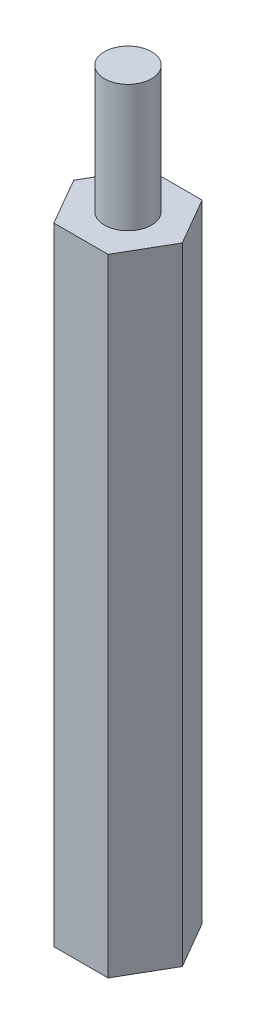
ISO-10303-21;
HEADER;
FILE_DESCRIPTION(('STEP AP214'),'2;1');
FILE_NAME('part.step','',(''),(''),'','','');
FILE_SCHEMA(('AUTOMOTIVE_DESIGN { 1 0 10303 214 1 1 1 1 }'));
ENDSEC;
DATA;
#1=APPLICATION_CONTEXT('core data for automotive mechanical design processes');
#2=APPLICATION_PROTOCOL_DEFINITION('international standard','automotive_design',2000,#1);
#3=PRODUCT_CONTEXT('',#1,'mechanical');
#4=PRODUCT('Part','Part','',(#3));
#5=PRODUCT_RELATED_PRODUCT_CATEGORY('part','',(#4));
#6=PRODUCT_DEFINITION_FORMATION('','',#4);
#7=PRODUCT_DEFINITION_CONTEXT('part definition',#1,'design');
#8=PRODUCT_DEFINITION('design','',#6,#7);
#9=PRODUCT_DEFINITION_SHAPE('','',#8);
#10=(LENGTH_UNIT() NAMED_UNIT(*) SI_UNIT(.MILLI.,.METRE.));
#11=(NAMED_UNIT(*) PLANE_ANGLE_UNIT() SI_UNIT($,.RADIAN.));
#12=(NAMED_UNIT(*) SI_UNIT($,.STERADIAN.) SOLID_ANGLE_UNIT());
#13=UNCERTAINTY_MEASURE_WITH_UNIT(LENGTH_MEASURE(1.E-05),#10,'distance_accuracy_value','');
#14=(GEOMETRIC_REPRESENTATION_CONTEXT(3) GLOBAL_UNCERTAINTY_ASSIGNED_CONTEXT((#13)) GLOBAL_UNIT_ASSIGNED_CONTEXT((#10,
#11,#12)) REPRESENTATION_CONTEXT('',''));
#15=CARTESIAN_POINT('',(0.,0.,0.));
#16=DIRECTION('',(0.,0.,1.));
#17=DIRECTION('',(1.,0.,0.));
#18=AXIS2_PLACEMENT_3D('',#15,#16,#17);
#19=CARTESIAN_POINT('',(-1.73205080756888,40.,-3.));
#20=DIRECTION('',(0.866025403784439,0.,0.5));
#21=DIRECTION('',(0.5,0.,-0.866025403784439));
#22=AXIS2_PLACEMENT_3D('',#19,#20,#21);
#23=PLANE('',#22);
#24=DIRECTION('',(-0.5,0.,0.866025403784439));
#25=VECTOR('',#24,1.);
#26=CARTESIAN_POINT('',(-1.73205080756888,0.,-3.));
#27=LINE('',#26,#25);
#28=CARTESIAN_POINT('',(-1.73205080756888,0.,-3.));
#29=VERTEX_POINT('',#28);
#30=CARTESIAN_POINT('',(-3.46410161513775,0.,0.));
#31=VERTEX_POINT('',#30);
#32=EDGE_CURVE('E123',#29,#31,#27,.T.);
#33=ORIENTED_EDGE('',*,*,#32,.T.);
#34=DIRECTION('',(0.,-1.,0.));
#35=VECTOR('',#34,1.);
#36=CARTESIAN_POINT('',(-3.46410161513775,40.,0.));
#37=LINE('',#36,#35);
#38=CARTESIAN_POINT('',(-3.46410161513775,40.,0.));
#39=VERTEX_POINT('',#38);
#40=EDGE_CURVE('E40',#39,#31,#37,.T.);
#41=ORIENTED_EDGE('',*,*,#40,.F.);
#42=DIRECTION('',(-0.5,0.,0.866025403784439));
#43=VECTOR('',#42,1.);
#44=CARTESIAN_POINT('',(-1.73205080756888,40.,-3.));
#45=LINE('',#44,#43);
#46=CARTESIAN_POINT('',(-1.73205080756888,40.,-3.));
#47=VERTEX_POINT('',#46);
#48=EDGE_CURVE('E134',#47,#39,#45,.T.);
#49=ORIENTED_EDGE('',*,*,#48,.F.);
#50=DIRECTION('',(0.,-1.,0.));
#51=VECTOR('',#50,1.);
#52=CARTESIAN_POINT('',(-1.73205080756888,40.,-3.));
#53=LINE('',#52,#51);
#54=EDGE_CURVE('E119',#47,#29,#53,.T.);
#55=ORIENTED_EDGE('',*,*,#54,.T.);
#56=EDGE_LOOP('',(#33,#41,#49,#55));
#57=FACE_BOUND('',#56,.T.);
#58=ADVANCED_FACE('F37',(#57),#23,.F.);
#59=CARTESIAN_POINT('',(-3.46410161513775,40.,0.));
#60=DIRECTION('',(0.866025403784439,0.,-0.5));
#61=DIRECTION('',(-0.5,0.,-0.866025403784439));
#62=AXIS2_PLACEMENT_3D('',#59,#60,#61);
#63=PLANE('',#62);
#64=DIRECTION('',(0.5,0.,0.866025403784439));
#65=VECTOR('',#64,1.);
#66=CARTESIAN_POINT('',(-3.46410161513775,0.,0.));
#67=LINE('',#66,#65);
#68=CARTESIAN_POINT('',(-1.73205080756888,0.,3.));
#69=VERTEX_POINT('',#68);
#70=EDGE_CURVE('E126',#31,#69,#67,.T.);
#71=ORIENTED_EDGE('',*,*,#70,.T.);
#72=DIRECTION('',(0.,-1.,0.));
#73=VECTOR('',#72,1.);
#74=CARTESIAN_POINT('',(-1.73205080756888,40.,3.));
#75=LINE('',#74,#73);
#76=CARTESIAN_POINT('',(-1.73205080756888,40.,3.));
#77=VERTEX_POINT('',#76);
#78=EDGE_CURVE('E137',#77,#69,#75,.T.);
#79=ORIENTED_EDGE('',*,*,#78,.F.);
#80=DIRECTION('',(0.5,0.,0.866025403784439));
#81=VECTOR('',#80,1.);
#82=CARTESIAN_POINT('',(-3.46410161513775,40.,0.));
#83=LINE('',#82,#81);
#84=EDGE_CURVE('E92',#39,#77,#83,.T.);
#85=ORIENTED_EDGE('',*,*,#84,.F.);
#86=ORIENTED_EDGE('',*,*,#40,.T.);
#87=EDGE_LOOP('',(#71,#79,#85,#86));
#88=FACE_BOUND('',#87,.T.);
#89=ADVANCED_FACE('F142',(#88),#63,.F.);
#90=CARTESIAN_POINT('',(-1.73205080756888,40.,3.));
#91=DIRECTION('',(0.,0.,-1.));
#92=DIRECTION('',(-1.,0.,0.));
#93=AXIS2_PLACEMENT_3D('',#90,#91,#92);
#94=PLANE('',#93);
#95=DIRECTION('',(1.,0.,0.));
#96=VECTOR('',#95,1.);
#97=CARTESIAN_POINT('',(-1.73205080756888,0.,3.));
#98=LINE('',#97,#96);
#99=CARTESIAN_POINT('',(1.73205080756888,0.,3.));
#100=VERTEX_POINT('',#99);
#101=EDGE_CURVE('E129',#69,#100,#98,.T.);
#102=ORIENTED_EDGE('',*,*,#101,.T.);
#103=DIRECTION('',(0.,-1.,0.));
#104=VECTOR('',#103,1.);
#105=CARTESIAN_POINT('',(1.73205080756888,40.,3.));
#106=LINE('',#105,#104);
#107=CARTESIAN_POINT('',(1.73205080756888,40.,3.));
#108=VERTEX_POINT('',#107);
#109=EDGE_CURVE('E114',#108,#100,#106,.T.);
#110=ORIENTED_EDGE('',*,*,#109,.F.);
#111=DIRECTION('',(1.,0.,0.));
#112=VECTOR('',#111,1.);
#113=CARTESIAN_POINT('',(-1.73205080756888,40.,3.));
#114=LINE('',#113,#112);
#115=EDGE_CURVE('E105',#77,#108,#114,.T.);
#116=ORIENTED_EDGE('',*,*,#115,.F.);
#117=ORIENTED_EDGE('',*,*,#78,.T.);
#118=EDGE_LOOP('',(#102,#110,#116,#117));
#119=FACE_BOUND('',#118,.T.);
#120=ADVANCED_FACE('F148',(#119),#94,.F.);
#121=CARTESIAN_POINT('',(1.73205080756888,40.,3.));
#122=DIRECTION('',(-0.866025403784439,0.,-0.5));
#123=DIRECTION('',(-0.5,0.,0.866025403784439));
#124=AXIS2_PLACEMENT_3D('',#121,#122,#123);
#125=PLANE('',#124);
#126=DIRECTION('',(0.5,0.,-0.866025403784439));
#127=VECTOR('',#126,1.);
#128=CARTESIAN_POINT('',(1.73205080756888,0.,3.));
#129=LINE('',#128,#127);
#130=CARTESIAN_POINT('',(3.46410161513775,0.,0.));
#131=VERTEX_POINT('',#130);
#132=EDGE_CURVE('E113',#100,#131,#129,.T.);
#133=ORIENTED_EDGE('',*,*,#132,.T.);
#134=DIRECTION('',(0.,-1.,0.));
#135=VECTOR('',#134,1.);
#136=CARTESIAN_POINT('',(3.46410161513775,40.,0.));
#137=LINE('',#136,#135);
#138=CARTESIAN_POINT('',(3.46410161513775,40.,0.));
#139=VERTEX_POINT('',#138);
#140=EDGE_CURVE('E110',#139,#131,#137,.T.);
#141=ORIENTED_EDGE('',*,*,#140,.F.);
#142=DIRECTION('',(0.5,0.,-0.866025403784439));
#143=VECTOR('',#142,1.);
#144=CARTESIAN_POINT('',(1.73205080756888,40.,3.));
#145=LINE('',#144,#143);
#146=EDGE_CURVE('E99',#108,#139,#145,.T.);
#147=ORIENTED_EDGE('',*,*,#146,.F.);
#148=ORIENTED_EDGE('',*,*,#109,.T.);
#149=EDGE_LOOP('',(#133,#141,#147,#148));
#150=FACE_BOUND('',#149,.T.);
#151=ADVANCED_FACE('F111',(#150),#125,.F.);
#152=CARTESIAN_POINT('',(3.46410161513775,40.,0.));
#153=DIRECTION('',(-0.866025403784439,0.,0.5));
#154=DIRECTION('',(0.5,0.,0.866025403784439));
#155=AXIS2_PLACEMENT_3D('',#152,#153,#154);
#156=PLANE('',#155);
#157=DIRECTION('',(-0.5,0.,-0.866025403784439));
#158=VECTOR('',#157,1.);
#159=CARTESIAN_POINT('',(3.46410161513775,0.,0.));
#160=LINE('',#159,#158);
#161=CARTESIAN_POINT('',(1.73205080756888,0.,-3.));
#162=VERTEX_POINT('',#161);
#163=EDGE_CURVE('E77',#131,#162,#160,.T.);
#164=ORIENTED_EDGE('',*,*,#163,.T.);
#165=DIRECTION('',(0.,-1.,0.));
#166=VECTOR('',#165,1.);
#167=CARTESIAN_POINT('',(1.73205080756888,40.,-3.));
#168=LINE('',#167,#166);
#169=CARTESIAN_POINT('',(1.73205080756888,40.,-3.));
#170=VERTEX_POINT('',#169);
#171=EDGE_CURVE('E115',#170,#162,#168,.T.);
#172=ORIENTED_EDGE('',*,*,#171,.F.);
#173=DIRECTION('',(-0.5,0.,-0.866025403784439));
#174=VECTOR('',#173,1.);
#175=CARTESIAN_POINT('',(3.46410161513775,40.,0.));
#176=LINE('',#175,#174);
#177=EDGE_CURVE('E103',#139,#170,#176,.T.);
#178=ORIENTED_EDGE('',*,*,#177,.F.);
#179=ORIENTED_EDGE('',*,*,#140,.T.);
#180=EDGE_LOOP('',(#164,#172,#178,#179));
#181=FACE_BOUND('',#180,.T.);
#182=ADVANCED_FACE('F117',(#181),#156,.F.);
#183=CARTESIAN_POINT('',(1.73205080756888,40.,-3.));
#184=DIRECTION('',(0.,0.,1.));
#185=DIRECTION('',(1.,0.,0.));
#186=AXIS2_PLACEMENT_3D('',#183,#184,#185);
#187=PLANE('',#186);
#188=DIRECTION('',(-1.,0.,0.));
#189=VECTOR('',#188,1.);
#190=CARTESIAN_POINT('',(1.73205080756888,0.,-3.));
#191=LINE('',#190,#189);
#192=EDGE_CURVE('E83',#162,#29,#191,.T.);
#193=ORIENTED_EDGE('',*,*,#192,.T.);
#194=ORIENTED_EDGE('',*,*,#54,.F.);
#195=DIRECTION('',(-1.,0.,0.));
#196=VECTOR('',#195,1.);
#197=CARTESIAN_POINT('',(1.73205080756888,40.,-3.));
#198=LINE('',#197,#196);
#199=EDGE_CURVE('E54',#170,#47,#198,.T.);
#200=ORIENTED_EDGE('',*,*,#199,.F.);
#201=ORIENTED_EDGE('',*,*,#171,.T.);
#202=EDGE_LOOP('',(#193,#194,#200,#201));
#203=FACE_BOUND('',#202,.T.);
#204=ADVANCED_FACE('F179',(#203),#187,.F.);
#205=CARTESIAN_POINT('',(0.,40.,0.));
#206=DIRECTION('',(0.,1.,0.));
#207=DIRECTION('',(0.,0.,1.));
#208=AXIS2_PLACEMENT_3D('',#205,#206,#207);
#209=PLANE('',#208);
#210=CARTESIAN_POINT('',(0.,40.,0.));
#211=DIRECTION('',(0.,1.,0.));
#212=DIRECTION('',(0.,0.,1.));
#213=AXIS2_PLACEMENT_3D('',#210,#211,#212);
#214=CIRCLE('',#213,1.5);
#215=CARTESIAN_POINT('',(0.,40.,1.5));
#216=VERTEX_POINT('',#215);
#217=EDGE_CURVE('E11',#216,#216,#214,.T.);
#218=ORIENTED_EDGE('',*,*,#217,.F.);
#219=EDGE_LOOP('',(#218));
#220=FACE_BOUND('',#219,.T.);
#221=ORIENTED_EDGE('',*,*,#48,.T.);
#222=ORIENTED_EDGE('',*,*,#84,.T.);
#223=ORIENTED_EDGE('',*,*,#115,.T.);
#224=ORIENTED_EDGE('',*,*,#146,.T.);
#225=ORIENTED_EDGE('',*,*,#177,.T.);
#226=ORIENTED_EDGE('',*,*,#199,.T.);
#227=EDGE_LOOP('',(#221,#222,#223,#224,#225,#226));
#228=FACE_BOUND('',#227,.T.);
#229=ADVANCED_FACE('F101',(#220,#228),#209,.T.);
#230=CARTESIAN_POINT('',(0.,0.,0.));
#231=DIRECTION('',(0.,1.,0.));
#232=DIRECTION('',(0.,0.,1.));
#233=AXIS2_PLACEMENT_3D('',#230,#231,#232);
#234=PLANE('',#233);
#235=CARTESIAN_POINT('',(0.,0.,0.));
#236=DIRECTION('',(0.,-1.,0.));
#237=DIRECTION('',(0.,0.,-1.));
#238=AXIS2_PLACEMENT_3D('',#235,#236,#237);
#239=CIRCLE('',#238,1.5);
#240=CARTESIAN_POINT('',(0.,0.,-1.5));
#241=VERTEX_POINT('',#240);
#242=EDGE_CURVE('E155',#241,#241,#239,.T.);
#243=ORIENTED_EDGE('',*,*,#242,.F.);
#244=EDGE_LOOP('',(#243));
#245=FACE_BOUND('',#244,.T.);
#246=ORIENTED_EDGE('',*,*,#32,.F.);
#247=ORIENTED_EDGE('',*,*,#192,.F.);
#248=ORIENTED_EDGE('',*,*,#163,.F.);
#249=ORIENTED_EDGE('',*,*,#132,.F.);
#250=ORIENTED_EDGE('',*,*,#101,.F.);
#251=ORIENTED_EDGE('',*,*,#70,.F.);
#252=EDGE_LOOP('',(#246,#247,#248,#249,#250,#251));
#253=FACE_BOUND('',#252,.T.);
#254=ADVANCED_FACE('F147',(#245,#253),#234,.F.);
#255=CARTESIAN_POINT('',(0.,48.0916054709663,0.));
#256=DIRECTION('',(0.,-1.,0.));
#257=DIRECTION('',(0.,0.,-1.));
#258=AXIS2_PLACEMENT_3D('',#255,#256,#257);
#259=CYLINDRICAL_SURFACE('',#258,1.5);
#260=CARTESIAN_POINT('',(0.,48.0916054709663,0.));
#261=DIRECTION('',(0.,1.,0.));
#262=DIRECTION('',(0.,0.,1.));
#263=AXIS2_PLACEMENT_3D('',#260,#261,#262);
#264=CIRCLE('',#263,1.5);
#265=CARTESIAN_POINT('',(0.,48.0916054709663,1.5));
#266=VERTEX_POINT('',#265);
#267=EDGE_CURVE('E127',#266,#266,#264,.T.);
#268=ORIENTED_EDGE('',*,*,#267,.F.);
#269=EDGE_LOOP('',(#268));
#270=FACE_BOUND('',#269,.T.);
#271=ORIENTED_EDGE('',*,*,#217,.T.);
#272=EDGE_LOOP('',(#271));
#273=FACE_BOUND('',#272,.T.);
#274=ADVANCED_FACE('F171',(#270,#273),#259,.T.);
#275=CARTESIAN_POINT('',(0.,48.0916054709663,0.));
#276=DIRECTION('',(0.,1.,0.));
#277=DIRECTION('',(0.,0.,1.));
#278=AXIS2_PLACEMENT_3D('',#275,#276,#277);
#279=PLANE('',#278);
#280=ORIENTED_EDGE('',*,*,#267,.T.);
#281=EDGE_LOOP('',(#280));
#282=FACE_BOUND('',#281,.T.);
#283=ADVANCED_FACE('F166',(#282),#279,.T.);
#284=CARTESIAN_POINT('',(0.,4.,0.));
#285=DIRECTION('',(0.,-1.,0.));
#286=DIRECTION('',(0.,0.,-1.));
#287=AXIS2_PLACEMENT_3D('',#284,#285,#286);
#288=CYLINDRICAL_SURFACE('',#287,1.5);
#289=CARTESIAN_POINT('',(0.,4.,0.));
#290=DIRECTION('',(0.,-1.,0.));
#291=DIRECTION('',(0.,0.,-1.));
#292=AXIS2_PLACEMENT_3D('',#289,#290,#291);
#293=CIRCLE('',#292,1.5);
#294=CARTESIAN_POINT('',(0.,4.,-1.5));
#295=VERTEX_POINT('',#294);
#296=EDGE_CURVE('E154',#295,#295,#293,.T.);
#297=ORIENTED_EDGE('',*,*,#296,.F.);
#298=EDGE_LOOP('',(#297));
#299=FACE_BOUND('',#298,.T.);
#300=ORIENTED_EDGE('',*,*,#242,.T.);
#301=EDGE_LOOP('',(#300));
#302=FACE_BOUND('',#301,.T.);
#303=ADVANCED_FACE('F163',(#299,#302),#288,.F.);
#304=CARTESIAN_POINT('',(0.,4.,0.));
#305=DIRECTION('',(0.,-1.,0.));
#306=DIRECTION('',(0.,0.,-1.));
#307=AXIS2_PLACEMENT_3D('',#304,#305,#306);
#308=PLANE('',#307);
#309=ORIENTED_EDGE('',*,*,#296,.T.);
#310=EDGE_LOOP('',(#309));
#311=FACE_BOUND('',#310,.T.);
#312=ADVANCED_FACE('F161',(#311),#308,.T.);
#313=CLOSED_SHELL('',(#58,#89,#120,#151,#182,#204,#229,#254,#274,#283,#303,#312));
#314=MANIFOLD_SOLID_BREP('B2',#313);
#315=ADVANCED_BREP_SHAPE_REPRESENTATION('',(#18,#314),#14);
#316=SHAPE_DEFINITION_REPRESENTATION(#9,#315);
ENDSEC;
END-ISO-10303-21;
